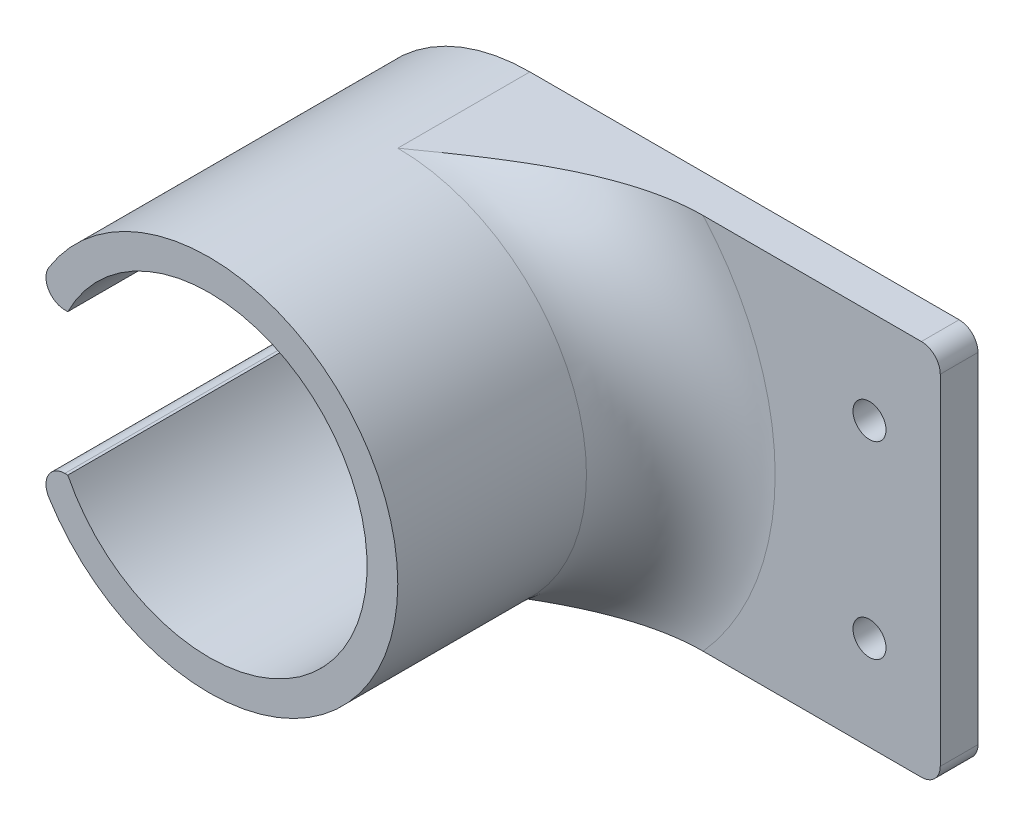
ISO-10303-21;
HEADER;
FILE_DESCRIPTION(('STEP AP214'),'2;1');
FILE_NAME('part.step','',(''),(''),'','','');
FILE_SCHEMA(('AUTOMOTIVE_DESIGN { 1 0 10303 214 1 1 1 1 }'));
ENDSEC;
DATA;
#1=APPLICATION_CONTEXT('core data for automotive mechanical design processes');
#2=APPLICATION_PROTOCOL_DEFINITION('international standard','automotive_design',2000,#1);
#3=PRODUCT_CONTEXT('',#1,'mechanical');
#4=PRODUCT('Part','Part','',(#3));
#5=PRODUCT_RELATED_PRODUCT_CATEGORY('part','',(#4));
#6=PRODUCT_DEFINITION_FORMATION('','',#4);
#7=PRODUCT_DEFINITION_CONTEXT('part definition',#1,'design');
#8=PRODUCT_DEFINITION('design','',#6,#7);
#9=PRODUCT_DEFINITION_SHAPE('','',#8);
#10=(LENGTH_UNIT() NAMED_UNIT(*) SI_UNIT(.MILLI.,.METRE.));
#11=(NAMED_UNIT(*) PLANE_ANGLE_UNIT() SI_UNIT($,.RADIAN.));
#12=(NAMED_UNIT(*) SI_UNIT($,.STERADIAN.) SOLID_ANGLE_UNIT());
#13=UNCERTAINTY_MEASURE_WITH_UNIT(LENGTH_MEASURE(1.E-05),#10,'distance_accuracy_value','');
#14=(GEOMETRIC_REPRESENTATION_CONTEXT(3) GLOBAL_UNCERTAINTY_ASSIGNED_CONTEXT((#13)) GLOBAL_UNIT_ASSIGNED_CONTEXT((#10,
#11,#12)) REPRESENTATION_CONTEXT('',''));
#15=CARTESIAN_POINT('',(0.,0.,0.));
#16=DIRECTION('',(0.,0.,1.));
#17=DIRECTION('',(1.,0.,0.));
#18=AXIS2_PLACEMENT_3D('',#15,#16,#17);
#19=CARTESIAN_POINT('',(0.,0.,4.));
#20=DIRECTION('',(0.,0.,1.));
#21=DIRECTION('',(1.,0.,0.));
#22=AXIS2_PLACEMENT_3D('',#19,#20,#21);
#23=PLANE('',#22);
#24=DIRECTION('',(1.,0.,0.));
#25=VECTOR('',#24,1.);
#26=CARTESIAN_POINT('',(0.,-7.5,4.));
#27=LINE('',#26,#25);
#28=CARTESIAN_POINT('',(-12.7008857958805,-7.5,4.));
#29=VERTEX_POINT('',#28);
#30=CARTESIAN_POINT('',(7.5,-7.5,4.));
#31=VERTEX_POINT('',#30);
#32=EDGE_CURVE('E175',#29,#31,#27,.T.);
#33=ORIENTED_EDGE('',*,*,#32,.F.);
#34=CARTESIAN_POINT('',(0.,0.,4.));
#35=DIRECTION('',(0.,0.,1.));
#36=DIRECTION('',(1.,0.,0.));
#37=AXIS2_PLACEMENT_3D('',#34,#35,#36);
#38=CIRCLE('',#37,14.75);
#39=CARTESIAN_POINT('',(14.5041666666667,-2.6817250615146,4.));
#40=VERTEX_POINT('',#39);
#41=EDGE_CURVE('E204',#29,#40,#38,.T.);
#42=ORIENTED_EDGE('',*,*,#41,.T.);
#43=CARTESIAN_POINT('',(7.5,0.,4.));
#44=DIRECTION('',(0.,0.,1.));
#45=DIRECTION('',(1.,0.,0.));
#46=AXIS2_PLACEMENT_3D('',#43,#44,#45);
#47=CIRCLE('',#46,7.5);
#48=EDGE_CURVE('E196',#31,#40,#47,.T.);
#49=ORIENTED_EDGE('',*,*,#48,.F.);
#50=EDGE_LOOP('',(#33,#42,#49));
#51=FACE_BOUND('',#50,.T.);
#52=ADVANCED_FACE('F47',(#51),#23,.T.);
#53=DIRECTION('',(0.,1.,0.));
#54=VECTOR('',#53,1.);
#55=CARTESIAN_POINT('',(47.5,20.,4.));
#56=LINE('',#55,#54);
#57=CARTESIAN_POINT('',(47.5,-18.,4.));
#58=VERTEX_POINT('',#57);
#59=CARTESIAN_POINT('',(47.5,18.,4.));
#60=VERTEX_POINT('',#59);
#61=EDGE_CURVE('E562',#58,#60,#56,.T.);
#62=ORIENTED_EDGE('',*,*,#61,.T.);
#63=CARTESIAN_POINT('',(45.5,18.,4.));
#64=DIRECTION('',(0.,0.,1.));
#65=DIRECTION('',(1.,0.,0.));
#66=AXIS2_PLACEMENT_3D('',#63,#64,#65);
#67=CIRCLE('',#66,2.);
#68=CARTESIAN_POINT('',(45.5,20.,4.));
#69=VERTEX_POINT('',#68);
#70=EDGE_CURVE('E56',#60,#69,#67,.T.);
#71=ORIENTED_EDGE('',*,*,#70,.T.);
#72=DIRECTION('',(-1.,0.,0.));
#73=VECTOR('',#72,1.);
#74=CARTESIAN_POINT('',(0.,20.,4.));
#75=LINE('',#74,#73);
#76=CARTESIAN_POINT('',(22.3606797749979,20.,4.));
#77=VERTEX_POINT('',#76);
#78=EDGE_CURVE('E566',#69,#77,#75,.T.);
#79=ORIENTED_EDGE('',*,*,#78,.T.);
#80=CARTESIAN_POINT('',(0.,0.,4.));
#81=DIRECTION('',(0.,0.,1.));
#82=DIRECTION('',(1.,0.,0.));
#83=AXIS2_PLACEMENT_3D('',#80,#81,#82);
#84=CIRCLE('',#83,30.);
#85=CARTESIAN_POINT('',(22.3606797749979,-20.,4.));
#86=VERTEX_POINT('',#85);
#87=EDGE_CURVE('E632',#77,#86,#84,.F.);
#88=ORIENTED_EDGE('',*,*,#87,.T.);
#89=DIRECTION('',(1.,0.,0.));
#90=VECTOR('',#89,1.);
#91=CARTESIAN_POINT('',(47.5,-20.,4.));
#92=LINE('',#91,#90);
#93=CARTESIAN_POINT('',(45.5,-20.,4.));
#94=VERTEX_POINT('',#93);
#95=EDGE_CURVE('E559',#86,#94,#92,.T.);
#96=ORIENTED_EDGE('',*,*,#95,.T.);
#97=CARTESIAN_POINT('',(45.5,-18.,4.));
#98=DIRECTION('',(0.,0.,1.));
#99=DIRECTION('',(1.,0.,0.));
#100=AXIS2_PLACEMENT_3D('',#97,#98,#99);
#101=CIRCLE('',#100,2.);
#102=EDGE_CURVE('E620',#94,#58,#101,.T.);
#103=ORIENTED_EDGE('',*,*,#102,.T.);
#104=EDGE_LOOP('',(#62,#71,#79,#88,#96,#103));
#105=FACE_BOUND('',#104,.T.);
#106=CARTESIAN_POINT('',(40.,10.,4.));
#107=DIRECTION('',(0.,0.,1.));
#108=DIRECTION('',(1.,0.,0.));
#109=AXIS2_PLACEMENT_3D('',#106,#107,#108);
#110=CIRCLE('',#109,1.75);
#111=CARTESIAN_POINT('',(41.75,10.,4.));
#112=VERTEX_POINT('',#111);
#113=EDGE_CURVE('E551',#112,#112,#110,.T.);
#114=ORIENTED_EDGE('',*,*,#113,.F.);
#115=EDGE_LOOP('',(#114));
#116=FACE_BOUND('',#115,.T.);
#117=CARTESIAN_POINT('',(40.,-10.,4.));
#118=DIRECTION('',(0.,0.,1.));
#119=DIRECTION('',(1.,0.,0.));
#120=AXIS2_PLACEMENT_3D('',#117,#118,#119);
#121=CIRCLE('',#120,1.75);
#122=CARTESIAN_POINT('',(41.75,-10.,4.));
#123=VERTEX_POINT('',#122);
#124=EDGE_CURVE('E535',#123,#123,#121,.T.);
#125=ORIENTED_EDGE('',*,*,#124,.F.);
#126=EDGE_LOOP('',(#125));
#127=FACE_BOUND('',#126,.T.);
#128=ADVANCED_FACE('F335',(#105,#116,#127),#23,.T.);
#129=CARTESIAN_POINT('',(0.,0.,0.));
#130=DIRECTION('',(0.,0.,1.));
#131=DIRECTION('',(1.,0.,0.));
#132=AXIS2_PLACEMENT_3D('',#129,#130,#131);
#133=PLANE('',#132);
#134=DIRECTION('',(-1.,0.,0.));
#135=VECTOR('',#134,1.);
#136=CARTESIAN_POINT('',(0.,20.,0.));
#137=LINE('',#136,#135);
#138=CARTESIAN_POINT('',(45.5,20.,0.));
#139=VERTEX_POINT('',#138);
#140=CARTESIAN_POINT('',(0.,20.,0.));
#141=VERTEX_POINT('',#140);
#142=EDGE_CURVE('E563',#139,#141,#137,.T.);
#143=ORIENTED_EDGE('',*,*,#142,.F.);
#144=CARTESIAN_POINT('',(45.5,18.,0.));
#145=DIRECTION('',(0.,0.,1.));
#146=DIRECTION('',(1.,0.,0.));
#147=AXIS2_PLACEMENT_3D('',#144,#145,#146);
#148=CIRCLE('',#147,2.);
#149=CARTESIAN_POINT('',(47.5,18.,0.));
#150=VERTEX_POINT('',#149);
#151=EDGE_CURVE('E604',#139,#150,#148,.F.);
#152=ORIENTED_EDGE('',*,*,#151,.T.);
#153=DIRECTION('',(0.,1.,0.));
#154=VECTOR('',#153,1.);
#155=CARTESIAN_POINT('',(47.5,20.,0.));
#156=LINE('',#155,#154);
#157=CARTESIAN_POINT('',(47.5,-18.,0.));
#158=VERTEX_POINT('',#157);
#159=EDGE_CURVE('E577',#158,#150,#156,.T.);
#160=ORIENTED_EDGE('',*,*,#159,.F.);
#161=CARTESIAN_POINT('',(45.5,-18.,0.));
#162=DIRECTION('',(0.,0.,1.));
#163=DIRECTION('',(1.,0.,0.));
#164=AXIS2_PLACEMENT_3D('',#161,#162,#163);
#165=CIRCLE('',#164,2.);
#166=CARTESIAN_POINT('',(45.5,-20.,0.));
#167=VERTEX_POINT('',#166);
#168=EDGE_CURVE('E600',#158,#167,#165,.F.);
#169=ORIENTED_EDGE('',*,*,#168,.T.);
#170=DIRECTION('',(1.,0.,0.));
#171=VECTOR('',#170,1.);
#172=CARTESIAN_POINT('',(47.5,-20.,0.));
#173=LINE('',#172,#171);
#174=CARTESIAN_POINT('',(0.,-20.,0.));
#175=VERTEX_POINT('',#174);
#176=EDGE_CURVE('E574',#175,#167,#173,.T.);
#177=ORIENTED_EDGE('',*,*,#176,.F.);
#178=CARTESIAN_POINT('',(0.,0.,0.));
#179=DIRECTION('',(0.,0.,1.));
#180=DIRECTION('',(1.,0.,0.));
#181=AXIS2_PLACEMENT_3D('',#178,#179,#180);
#182=CIRCLE('',#181,20.);
#183=CARTESIAN_POINT('',(-16.9876498349118,-10.5555555555556,0.));
#184=VERTEX_POINT('',#183);
#185=EDGE_CURVE('E555',#184,#175,#182,.T.);
#186=ORIENTED_EDGE('',*,*,#185,.F.);
#187=CARTESIAN_POINT('',(-15.2888848514207,-9.5,0.));
#188=DIRECTION('',(0.,0.,1.));
#189=DIRECTION('',(1.,0.,0.));
#190=AXIS2_PLACEMENT_3D('',#187,#188,#189);
#191=CIRCLE('',#190,2.);
#192=CARTESIAN_POINT('',(-15.2888848514207,-7.5,0.));
#193=VERTEX_POINT('',#192);
#194=EDGE_CURVE('E683',#184,#193,#191,.F.);
#195=ORIENTED_EDGE('',*,*,#194,.T.);
#196=DIRECTION('',(1.,0.,0.));
#197=VECTOR('',#196,1.);
#198=CARTESIAN_POINT('',(0.,-7.5,0.));
#199=LINE('',#198,#197);
#200=CARTESIAN_POINT('',(7.5,-7.5,0.));
#201=VERTEX_POINT('',#200);
#202=EDGE_CURVE('E652',#193,#201,#199,.T.);
#203=ORIENTED_EDGE('',*,*,#202,.T.);
#204=CARTESIAN_POINT('',(7.5,0.,0.));
#205=DIRECTION('',(0.,0.,-1.));
#206=DIRECTION('',(-1.,0.,0.));
#207=AXIS2_PLACEMENT_3D('',#204,#205,#206);
#208=CIRCLE('',#207,7.5);
#209=CARTESIAN_POINT('',(7.5,7.5,0.));
#210=VERTEX_POINT('',#209);
#211=EDGE_CURVE('E199',#210,#201,#208,.T.);
#212=ORIENTED_EDGE('',*,*,#211,.F.);
#213=DIRECTION('',(-1.,0.,0.));
#214=VECTOR('',#213,1.);
#215=CARTESIAN_POINT('',(0.,7.5,0.));
#216=LINE('',#215,#214);
#217=CARTESIAN_POINT('',(-15.2888848514207,7.5,0.));
#218=VERTEX_POINT('',#217);
#219=EDGE_CURVE('E225',#210,#218,#216,.T.);
#220=ORIENTED_EDGE('',*,*,#219,.T.);
#221=CARTESIAN_POINT('',(-15.2888848514207,9.5,0.));
#222=DIRECTION('',(0.,0.,1.));
#223=DIRECTION('',(1.,0.,0.));
#224=AXIS2_PLACEMENT_3D('',#221,#222,#223);
#225=CIRCLE('',#224,2.);
#226=CARTESIAN_POINT('',(-16.9876498349118,10.5555555555556,0.));
#227=VERTEX_POINT('',#226);
#228=EDGE_CURVE('E681',#218,#227,#225,.F.);
#229=ORIENTED_EDGE('',*,*,#228,.T.);
#230=EDGE_CURVE('E570',#141,#227,#182,.T.);
#231=ORIENTED_EDGE('',*,*,#230,.F.);
#232=EDGE_LOOP('',(#143,#152,#160,#169,#177,#186,#195,#203,#212,#220,#229,#231));
#233=FACE_BOUND('',#232,.T.);
#234=CARTESIAN_POINT('',(40.,10.,0.));
#235=DIRECTION('',(0.,0.,1.));
#236=DIRECTION('',(1.,0.,0.));
#237=AXIS2_PLACEMENT_3D('',#234,#235,#236);
#238=CIRCLE('',#237,1.75);
#239=CARTESIAN_POINT('',(41.75,10.,0.));
#240=VERTEX_POINT('',#239);
#241=EDGE_CURVE('E545',#240,#240,#238,.T.);
#242=ORIENTED_EDGE('',*,*,#241,.T.);
#243=EDGE_LOOP('',(#242));
#244=FACE_BOUND('',#243,.T.);
#245=CARTESIAN_POINT('',(40.,-10.,0.));
#246=DIRECTION('',(0.,0.,1.));
#247=DIRECTION('',(1.,0.,0.));
#248=AXIS2_PLACEMENT_3D('',#245,#246,#247);
#249=CIRCLE('',#248,1.75);
#250=CARTESIAN_POINT('',(41.75,-10.,0.));
#251=VERTEX_POINT('',#250);
#252=EDGE_CURVE('E538',#251,#251,#249,.T.);
#253=ORIENTED_EDGE('',*,*,#252,.T.);
#254=EDGE_LOOP('',(#253));
#255=FACE_BOUND('',#254,.T.);
#256=ADVANCED_FACE('F339',(#233,#244,#255),#133,.F.);
#257=CARTESIAN_POINT('',(0.,0.,4.));
#258=DIRECTION('',(0.,0.,-1.));
#259=DIRECTION('',(-1.,0.,0.));
#260=AXIS2_PLACEMENT_3D('',#257,#258,#259);
#261=CYLINDRICAL_SURFACE('',#260,20.);
#262=CARTESIAN_POINT('',(0.,0.,34.));
#263=DIRECTION('',(0.,0.,1.));
#264=DIRECTION('',(1.,0.,0.));
#265=AXIS2_PLACEMENT_3D('',#262,#263,#264);
#266=CIRCLE('',#265,20.);
#267=CARTESIAN_POINT('',(-16.9876498349118,-10.5555555555556,34.));
#268=VERTEX_POINT('',#267);
#269=CARTESIAN_POINT('',(-16.9876498349118,10.5555555555556,34.));
#270=VERTEX_POINT('',#269);
#271=EDGE_CURVE('E541',#268,#270,#266,.T.);
#272=ORIENTED_EDGE('',*,*,#271,.F.);
#273=DIRECTION('',(0.,0.,-1.));
#274=VECTOR('',#273,1.);
#275=CARTESIAN_POINT('',(-16.9876498349118,-10.5555555555556,4.));
#276=LINE('',#275,#274);
#277=EDGE_CURVE('E595',#268,#184,#276,.T.);
#278=ORIENTED_EDGE('',*,*,#277,.T.);
#279=ORIENTED_EDGE('',*,*,#185,.T.);
#280=DIRECTION('',(0.,0.,-1.));
#281=VECTOR('',#280,1.);
#282=CARTESIAN_POINT('',(0.,-20.,4.));
#283=LINE('',#282,#281);
#284=CARTESIAN_POINT('',(0.,-20.,14.));
#285=VERTEX_POINT('',#284);
#286=EDGE_CURVE('E189',#285,#175,#283,.T.);
#287=ORIENTED_EDGE('',*,*,#286,.F.);
#288=CARTESIAN_POINT('',(0.,0.,14.));
#289=DIRECTION('',(0.,0.,1.));
#290=DIRECTION('',(1.,0.,0.));
#291=AXIS2_PLACEMENT_3D('',#288,#289,#290);
#292=CIRCLE('',#291,20.);
#293=CARTESIAN_POINT('',(0.,20.,14.));
#294=VERTEX_POINT('',#293);
#295=EDGE_CURVE('E212',#285,#294,#292,.T.);
#296=ORIENTED_EDGE('',*,*,#295,.T.);
#297=DIRECTION('',(0.,0.,-1.));
#298=VECTOR('',#297,1.);
#299=CARTESIAN_POINT('',(0.,20.,4.));
#300=LINE('',#299,#298);
#301=EDGE_CURVE('E569',#294,#141,#300,.T.);
#302=ORIENTED_EDGE('',*,*,#301,.T.);
#303=ORIENTED_EDGE('',*,*,#230,.T.);
#304=DIRECTION('',(0.,0.,-1.));
#305=VECTOR('',#304,1.);
#306=CARTESIAN_POINT('',(-16.9876498349118,10.5555555555556,4.));
#307=LINE('',#306,#305);
#308=EDGE_CURVE('E301',#227,#270,#307,.F.);
#309=ORIENTED_EDGE('',*,*,#308,.T.);
#310=EDGE_LOOP('',(#272,#278,#279,#287,#296,#302,#303,#309));
#311=FACE_BOUND('',#310,.T.);
#312=ADVANCED_FACE('F374',(#311),#261,.T.);
#313=CARTESIAN_POINT('',(47.5,-20.,4.));
#314=DIRECTION('',(0.,1.,0.));
#315=DIRECTION('',(-1.,0.,0.));
#316=AXIS2_PLACEMENT_3D('',#313,#314,#315);
#317=PLANE('',#316);
#318=ORIENTED_EDGE('',*,*,#176,.T.);
#319=DIRECTION('',(0.,0.,-1.));
#320=VECTOR('',#319,1.);
#321=CARTESIAN_POINT('',(45.5,-20.,4.));
#322=LINE('',#321,#320);
#323=EDGE_CURVE('E11',#167,#94,#322,.F.);
#324=ORIENTED_EDGE('',*,*,#323,.T.);
#325=ORIENTED_EDGE('',*,*,#95,.F.);
#326=CARTESIAN_POINT('',(22.3606797749979,-20.,4.));
#327=CARTESIAN_POINT('',(21.7668018034509,-20.,4.00003263304139));
#328=CARTESIAN_POINT('',(21.1735054519941,-20.,4.02937199032722));
#329=CARTESIAN_POINT('',(19.9929463902144,-20.,4.14044320763126));
#330=CARTESIAN_POINT('',(19.4056740045382,-20.,4.22207043394376));
#331=CARTESIAN_POINT('',(18.2492269467343,-20.,4.4298222050329));
#332=CARTESIAN_POINT('',(17.6799134884316,-20.,4.55519253264605));
#333=CARTESIAN_POINT('',(16.5512195723283,-20.,4.84528301300506));
#334=CARTESIAN_POINT('',(15.9918448606384,-20.,5.01002518123025));
#335=CARTESIAN_POINT('',(14.2261122860694,-20.,5.58998860297849));
#336=CARTESIAN_POINT('',(13.040827012144,-20.,6.07022599754348));
#337=CARTESIAN_POINT('',(11.3048964890977,-20.,6.87830371516584));
#338=CARTESIAN_POINT('',(10.7327633759368,-20.,7.16257464351929));
#339=CARTESIAN_POINT('',(9.60126056211567,-20.,7.75554576306232));
#340=CARTESIAN_POINT('',(9.04188966050424,-20.,8.0642436433063));
#341=CARTESIAN_POINT('',(7.37111678417109,-20.,9.02560610499008));
#342=CARTESIAN_POINT('',(6.27728151271615,-20.,9.70859299261349));
#343=CARTESIAN_POINT('',(4.12150483975176,-20.,11.1209344512402));
#344=CARTESIAN_POINT('',(3.05954929259503,-20.,11.8502679958212));
#345=CARTESIAN_POINT('',(1.34193969195753,-20.,13.051169366932));
#346=CARTESIAN_POINT('',(0.682503584222825,-20.,13.5173978259668));
#347=CARTESIAN_POINT('',(0.0153960074116556,-20.,13.9891133783914));
#348=CARTESIAN_POINT('',(0.00769800382480433,-20.,13.9945566889278));
#349=CARTESIAN_POINT('',(0.,-20.,14.));
#350=B_SPLINE_CURVE_WITH_KNOTS('',3,(#326,#327,#328,#329,#330,#331,#332,#333,#334,#335,#336,
#337,#338,#339,#340,#341,#342,#343,#344,#345,#346,#347,#348,#349),.UNSPECIFIED.,.F.,.F.,(4,2,2,
2,2,2,2,2,2,2,2,4),(0.,1.78007201554742,3.55659299450599,5.30388464058657,7.05215561193781,
10.8779322078743,12.7942256891128,14.7103380930116,18.5765462026268,22.4410126539085,
24.8638369819083,24.8921212531558),.UNSPECIFIED.);
#351=EDGE_CURVE('E235',#86,#285,#350,.T.);
#352=ORIENTED_EDGE('',*,*,#351,.T.);
#353=ORIENTED_EDGE('',*,*,#286,.T.);
#354=EDGE_LOOP('',(#318,#324,#325,#352,#353));
#355=FACE_BOUND('',#354,.T.);
#356=ADVANCED_FACE('F378',(#355),#317,.F.);
#357=CARTESIAN_POINT('',(47.5,20.,4.));
#358=DIRECTION('',(-1.,0.,0.));
#359=DIRECTION('',(0.,0.,1.));
#360=AXIS2_PLACEMENT_3D('',#357,#358,#359);
#361=PLANE('',#360);
#362=ORIENTED_EDGE('',*,*,#159,.T.);
#363=DIRECTION('',(0.,0.,-1.));
#364=VECTOR('',#363,1.);
#365=CARTESIAN_POINT('',(47.5,18.,4.));
#366=LINE('',#365,#364);
#367=EDGE_CURVE('E69',#150,#60,#366,.F.);
#368=ORIENTED_EDGE('',*,*,#367,.T.);
#369=ORIENTED_EDGE('',*,*,#61,.F.);
#370=DIRECTION('',(0.,0.,-1.));
#371=VECTOR('',#370,1.);
#372=CARTESIAN_POINT('',(47.5,-18.,4.));
#373=LINE('',#372,#371);
#374=EDGE_CURVE('E609',#58,#158,#373,.T.);
#375=ORIENTED_EDGE('',*,*,#374,.T.);
#376=EDGE_LOOP('',(#362,#368,#369,#375));
#377=FACE_BOUND('',#376,.T.);
#378=ADVANCED_FACE('F466',(#377),#361,.F.);
#379=CARTESIAN_POINT('',(0.,20.,4.));
#380=DIRECTION('',(0.,-1.,0.));
#381=DIRECTION('',(1.,0.,0.));
#382=AXIS2_PLACEMENT_3D('',#379,#380,#381);
#383=PLANE('',#382);
#384=ORIENTED_EDGE('',*,*,#78,.F.);
#385=DIRECTION('',(0.,0.,-1.));
#386=VECTOR('',#385,1.);
#387=CARTESIAN_POINT('',(45.5,20.,4.));
#388=LINE('',#387,#386);
#389=EDGE_CURVE('E605',#69,#139,#388,.T.);
#390=ORIENTED_EDGE('',*,*,#389,.T.);
#391=ORIENTED_EDGE('',*,*,#142,.T.);
#392=ORIENTED_EDGE('',*,*,#301,.F.);
#393=CARTESIAN_POINT('',(22.3606797749979,20.,4.));
#394=CARTESIAN_POINT('',(21.7668018034508,20.,4.00003263304139));
#395=CARTESIAN_POINT('',(21.1735054519941,20.,4.02937199032722));
#396=CARTESIAN_POINT('',(19.9929463902143,20.,4.14044320763127));
#397=CARTESIAN_POINT('',(19.405674004538,20.,4.22207043394378));
#398=CARTESIAN_POINT('',(18.2492269467342,20.,4.42982220503293));
#399=CARTESIAN_POINT('',(17.6799134884315,20.,4.55519253264607));
#400=CARTESIAN_POINT('',(16.5512195723283,20.,4.84528301300507));
#401=CARTESIAN_POINT('',(15.9918448606384,20.,5.01002518123025));
#402=CARTESIAN_POINT('',(14.2261122860694,20.,5.58998860297849));
#403=CARTESIAN_POINT('',(13.040827012144,20.,6.07022599754347));
#404=CARTESIAN_POINT('',(11.3048964890978,20.,6.87830371516582));
#405=CARTESIAN_POINT('',(10.7327633759368,20.,7.16257464351927));
#406=CARTESIAN_POINT('',(9.60126056211573,20.,7.75554576306229));
#407=CARTESIAN_POINT('',(9.0418896605043,20.,8.06424364330627));
#408=CARTESIAN_POINT('',(7.37111678417113,20.,9.02560610499003));
#409=CARTESIAN_POINT('',(6.27728151271612,20.,9.70859299261338));
#410=CARTESIAN_POINT('',(4.12150483975182,20.,11.1209344512403));
#411=CARTESIAN_POINT('',(3.05954929259524,20.,11.8502679958216));
#412=CARTESIAN_POINT('',(1.34193969195732,20.,13.0511693669318));
#413=CARTESIAN_POINT('',(0.682503584222314,20.,13.5173978259661));
#414=CARTESIAN_POINT('',(0.0153960074116444,20.,13.9891133783914));
#415=CARTESIAN_POINT('',(0.00769800382479868,20.,13.9945566889278));
#416=CARTESIAN_POINT('',(0.,20.,14.));
#417=B_SPLINE_CURVE_WITH_KNOTS('',3,(#393,#394,#395,#396,#397,#398,#399,#400,#401,#402,#403,
#404,#405,#406,#407,#408,#409,#410,#411,#412,#413,#414,#415,#416),.UNSPECIFIED.,.F.,.F.,(4,2,2,
2,2,2,2,2,2,2,2,4),(0.,1.78007201554749,3.55659299450612,5.30388464058663,7.05215561193781,
10.8779322078743,12.7942256891127,14.7103380930115,18.5765462026267,22.4410126539085,
24.8638369819083,24.8921212531558),.UNSPECIFIED.);
#418=EDGE_CURVE('E242',#294,#77,#417,.F.);
#419=ORIENTED_EDGE('',*,*,#418,.T.);
#420=EDGE_LOOP('',(#384,#390,#391,#392,#419));
#421=FACE_BOUND('',#420,.T.);
#422=ADVANCED_FACE('F461',(#421),#383,.F.);
#423=CARTESIAN_POINT('',(40.,10.,4.));
#424=DIRECTION('',(0.,0.,-1.));
#425=DIRECTION('',(-1.,0.,0.));
#426=AXIS2_PLACEMENT_3D('',#423,#424,#425);
#427=CYLINDRICAL_SURFACE('',#426,1.75);
#428=ORIENTED_EDGE('',*,*,#113,.T.);
#429=EDGE_LOOP('',(#428));
#430=FACE_BOUND('',#429,.T.);
#431=ORIENTED_EDGE('',*,*,#241,.F.);
#432=EDGE_LOOP('',(#431));
#433=FACE_BOUND('',#432,.T.);
#434=ADVANCED_FACE('F465',(#430,#433),#427,.F.);
#435=CARTESIAN_POINT('',(40.,-10.,4.));
#436=DIRECTION('',(0.,0.,-1.));
#437=DIRECTION('',(-1.,0.,0.));
#438=AXIS2_PLACEMENT_3D('',#435,#436,#437);
#439=CYLINDRICAL_SURFACE('',#438,1.75);
#440=ORIENTED_EDGE('',*,*,#124,.T.);
#441=EDGE_LOOP('',(#440));
#442=FACE_BOUND('',#441,.T.);
#443=ORIENTED_EDGE('',*,*,#252,.F.);
#444=EDGE_LOOP('',(#443));
#445=FACE_BOUND('',#444,.T.);
#446=ADVANCED_FACE('F387',(#442,#445),#439,.F.);
#447=CARTESIAN_POINT('',(0.,0.,34.));
#448=DIRECTION('',(0.,0.,1.));
#449=DIRECTION('',(1.,0.,0.));
#450=AXIS2_PLACEMENT_3D('',#447,#448,#449);
#451=PLANE('',#450);
#452=DIRECTION('',(-1.,0.,0.));
#453=VECTOR('',#452,1.);
#454=CARTESIAN_POINT('',(7.5,-7.5,34.));
#455=LINE('',#454,#453);
#456=CARTESIAN_POINT('',(-14.9770658007502,-7.5,34.));
#457=VERTEX_POINT('',#456);
#458=CARTESIAN_POINT('',(-15.2888848514207,-7.5,34.));
#459=VERTEX_POINT('',#458);
#460=EDGE_CURVE('E667',#457,#459,#455,.T.);
#461=ORIENTED_EDGE('',*,*,#460,.T.);
#462=CARTESIAN_POINT('',(-15.2888848514207,-9.5,34.));
#463=DIRECTION('',(0.,0.,1.));
#464=DIRECTION('',(1.,0.,0.));
#465=AXIS2_PLACEMENT_3D('',#462,#463,#464);
#466=CIRCLE('',#465,2.);
#467=EDGE_CURVE('E691',#459,#268,#466,.T.);
#468=ORIENTED_EDGE('',*,*,#467,.T.);
#469=ORIENTED_EDGE('',*,*,#271,.T.);
#470=CARTESIAN_POINT('',(-15.2888848514207,9.5,34.));
#471=DIRECTION('',(0.,0.,1.));
#472=DIRECTION('',(1.,0.,0.));
#473=AXIS2_PLACEMENT_3D('',#470,#471,#472);
#474=CIRCLE('',#473,2.);
#475=CARTESIAN_POINT('',(-15.2888848514207,7.5,34.));
#476=VERTEX_POINT('',#475);
#477=EDGE_CURVE('E669',#270,#476,#474,.T.);
#478=ORIENTED_EDGE('',*,*,#477,.T.);
#479=DIRECTION('',(1.,0.,0.));
#480=VECTOR('',#479,1.);
#481=CARTESIAN_POINT('',(7.5,7.5,34.));
#482=LINE('',#481,#480);
#483=CARTESIAN_POINT('',(-14.9770658007502,7.5,34.));
#484=VERTEX_POINT('',#483);
#485=EDGE_CURVE('E202',#476,#484,#482,.T.);
#486=ORIENTED_EDGE('',*,*,#485,.T.);
#487=CARTESIAN_POINT('',(0.,0.,34.));
#488=DIRECTION('',(0.,0.,1.));
#489=DIRECTION('',(1.,0.,0.));
#490=AXIS2_PLACEMENT_3D('',#487,#488,#489);
#491=CIRCLE('',#490,16.75);
#492=EDGE_CURVE('E548',#457,#484,#491,.T.);
#493=ORIENTED_EDGE('',*,*,#492,.F.);
#494=EDGE_LOOP('',(#461,#468,#469,#478,#486,#493));
#495=FACE_BOUND('',#494,.T.);
#496=ADVANCED_FACE('F273',(#495),#451,.T.);
#497=CARTESIAN_POINT('',(0.,0.,34.));
#498=DIRECTION('',(0.,0.,-1.));
#499=DIRECTION('',(-1.,0.,0.));
#500=AXIS2_PLACEMENT_3D('',#497,#498,#499);
#501=CYLINDRICAL_SURFACE('',#500,16.75);
#502=DIRECTION('',(0.,0.,-1.));
#503=VECTOR('',#502,1.);
#504=CARTESIAN_POINT('',(-14.9770658007502,7.5,34.));
#505=LINE('',#504,#503);
#506=CARTESIAN_POINT('',(-14.9770658007502,7.5,6.));
#507=VERTEX_POINT('',#506);
#508=EDGE_CURVE('E651',#507,#484,#505,.F.);
#509=ORIENTED_EDGE('',*,*,#508,.F.);
#510=CARTESIAN_POINT('',(0.,0.,6.));
#511=DIRECTION('',(0.,0.,1.));
#512=DIRECTION('',(1.,0.,0.));
#513=AXIS2_PLACEMENT_3D('',#510,#511,#512);
#514=CIRCLE('',#513,16.75);
#515=CARTESIAN_POINT('',(16.4708333333333,3.04534879866912,6.));
#516=VERTEX_POINT('',#515);
#517=EDGE_CURVE('E263',#507,#516,#514,.F.);
#518=ORIENTED_EDGE('',*,*,#517,.T.);
#519=CARTESIAN_POINT('',(15.9505788675956,5.11287920731671,5.94987984284756));
#520=CARTESIAN_POINT('',(16.0003082966242,4.95773899226411,3.47216732107097));
#521=CARTESIAN_POINT('',(13.6794377144012,4.25024111478821,4.));
#522=CARTESIAN_POINT('',(16.0177412429025,4.90337723381543,5.96258487059454));
#523=CARTESIAN_POINT('',(16.0550593484335,4.78036957865644,3.549592780556));
#524=CARTESIAN_POINT('',(13.7786800156369,4.10601124006457,4.));
#525=CARTESIAN_POINT('',(16.0808189659863,4.69237216558887,5.97219791683703));
#526=CARTESIAN_POINT('',(16.1096418073176,4.59289475632053,3.61953659787191));
#527=CARTESIAN_POINT('',(13.8744627693304,3.95587628529017,4.));
#528=CARTESIAN_POINT('',(16.1986403299141,4.26790169232043,5.98666058186651));
#529=CARTESIAN_POINT('',(16.2141358501095,4.20784053352845,3.74376135927388));
#530=CARTESIAN_POINT('',(14.0574050856073,3.64457066622454,4.));
#531=CARTESIAN_POINT('',(16.2533864810883,4.05443704929218,5.99151163786742));
#532=CARTESIAN_POINT('',(16.2643790657867,4.00978007042261,3.79871079688693));
#533=CARTESIAN_POINT('',(14.1445672428225,3.4834033473244,4.));
#534=CARTESIAN_POINT('',(16.3543941661064,3.62557865723691,5.99787514250514));
#535=CARTESIAN_POINT('',(16.3584938306032,3.60620219064712,3.89560477724452));
#536=CARTESIAN_POINT('',(14.3085832069233,3.15080670052285,4.));
#537=CARTESIAN_POINT('',(16.4006601335294,3.41018597835622,5.99938934029702));
#538=CARTESIAN_POINT('',(16.4026843133134,3.40010633589762,3.93802391905863));
#539=CARTESIAN_POINT('',(14.3854423946908,2.97938279747367,4.));
#540=CARTESIAN_POINT('',(16.4846649242135,2.97772415298687,6.00030396486693));
#541=CARTESIAN_POINT('',(16.4837168537462,2.98227010587435,4.01207449676235));
#542=CARTESIAN_POINT('',(14.5273344056079,2.6272776794202,4.));
#543=CARTESIAN_POINT('',(16.5224030901489,2.76065487859846,5.99970422876137));
#544=CARTESIAN_POINT('',(16.5208374812251,2.76987278614159,4.04403341359768));
#545=CARTESIAN_POINT('',(14.5923663170321,2.44659575212046,4.));
#546=CARTESIAN_POINT('',(16.5884673989609,2.3305418811657,5.9974918046817));
#547=CARTESIAN_POINT('',(16.5862041707078,2.34621457179201,4.09817993781891));
#548=CARTESIAN_POINT('',(14.7077278902359,2.08190601148726,4.));
#549=CARTESIAN_POINT('',(16.6170015047774,2.11752984604955,5.99590429687421));
#550=CARTESIAN_POINT('',(16.6148522828687,2.13445863937957,4.12079118264495));
#551=CARTESIAN_POINT('',(14.75837875326,1.89808817004059,4.));
#552=CARTESIAN_POINT('',(16.665852885763,1.69056726643116,5.99256355342676));
#553=CARTESIAN_POINT('',(16.6640277639659,1.70835542036285,4.15854851010028));
#554=CARTESIAN_POINT('',(14.8459162179312,1.52456699728881,4.));
#555=CARTESIAN_POINT('',(16.6861701658906,1.47661672249533,5.99081031788682));
#556=CARTESIAN_POINT('',(16.6847207899741,1.49331310088098,4.17383426763433));
#557=CARTESIAN_POINT('',(14.8828028278841,1.33486366953536,4.));
#558=CARTESIAN_POINT('',(16.7185588015947,1.04807783505523,5.98776262916382));
#559=CARTESIAN_POINT('',(16.7177079660575,1.06179938186949,4.19779603273431));
#560=CARTESIAN_POINT('',(14.9419407595896,0.951394750980597,4.));
#561=CARTESIAN_POINT('',(16.7306297805152,0.833489462867216,5.98646819693827));
#562=CARTESIAN_POINT('',(16.730113774429,0.844606107776836,4.20655652599181));
#563=CARTESIAN_POINT('',(14.9641914128316,0.757628975040401,4.));
#564=CARTESIAN_POINT('',(16.7465059997805,0.403999909880524,5.98472561664843));
#565=CARTESIAN_POINT('',(16.7463920975981,0.409914535904877,4.21798948870537));
#566=CARTESIAN_POINT('',(14.9935096442861,0.368061517903531,4.));
#567=CARTESIAN_POINT('',(16.7503111286321,0.189098724901622,5.98427747999933));
#568=CARTESIAN_POINT('',(16.7503200615372,0.191678190519051,4.22070121077539));
#569=CARTESIAN_POINT('',(15.0005770177001,0.172259809281135,4.));
#570=CARTESIAN_POINT('',(16.7496344711393,-0.250216965987576,5.98435574303145));
#571=CARTESIAN_POINT('',(16.749623978128,-0.25366619540928,4.22021847829123));
#572=CARTESIAN_POINT('',(14.9993221432655,-0.227936004380487,4.));
#573=CARTESIAN_POINT('',(16.7447779317102,-0.474630976943812,5.98492621474205));
#574=CARTESIAN_POINT('',(16.7446102349874,-0.481565968092966,4.21675489089321));
#575=CARTESIAN_POINT('',(14.9903039401537,-0.432326315718984,4.));
#576=CARTESIAN_POINT('',(16.7260513826182,-0.923076077876473,5.98695548528712));
#577=CARTESIAN_POINT('',(16.7254209470668,-0.935242619875944,4.2032369173152));
#578=CARTESIAN_POINT('',(14.9557568430206,-0.838605258227304,4.));
#579=CARTESIAN_POINT('',(16.7121813777492,-1.1471071680565,5.9884142836491));
#580=CARTESIAN_POINT('',(16.7111739767377,-1.16185856831514,4.19313168402316));
#581=CARTESIAN_POINT('',(14.9302279577809,-1.04049389072766,4.));
#582=CARTESIAN_POINT('',(16.6754511893566,-1.59442371157164,5.99173633904748));
#583=CARTESIAN_POINT('',(16.6738248906512,-1.61172769787834,4.16578730891991));
#584=CARTESIAN_POINT('',(14.8633406291882,-1.43949168635427,4.));
#585=CARTESIAN_POINT('',(16.6525911393738,-1.81770917593282,5.99359959007584));
#586=CARTESIAN_POINT('',(16.6505846780741,-1.83579877648645,4.14844206126797));
#587=CARTESIAN_POINT('',(14.8219824209689,-1.63660092042897,4.));
#588=CARTESIAN_POINT('',(16.5979172286893,-2.26318450871097,5.99697214197623));
#589=CARTESIAN_POINT('',(16.5957238176095,-2.27929470705689,4.10570405225925));
#590=CARTESIAN_POINT('',(14.7244935407452,-2.02400518993949,4.));
#591=CARTESIAN_POINT('',(16.5661033724565,-2.48537437767467,5.99848144302493));
#592=CARTESIAN_POINT('',(16.563901968926,-2.49950340002681,4.08013686976804));
#593=CARTESIAN_POINT('',(14.6683628761134,-2.21430022877614,4.));
#594=CARTESIAN_POINT('',(16.4926148313627,-2.93414455774959,6.00018115895081));
#595=CARTESIAN_POINT('',(16.4915894936959,-2.93969100012798,4.01885950795048));
#596=CARTESIAN_POINT('',(14.5410258042401,-2.59124866750303,4.));
#597=CARTESIAN_POINT('',(16.4507023446588,-3.16068623362954,6.00033576331048));
#598=CARTESIAN_POINT('',(16.450631424421,-3.16020560550079,3.98263131832396));
#599=CARTESIAN_POINT('',(14.4694610379634,-2.77767388704803,4.));
#600=CARTESIAN_POINT('',(16.3575782009438,-3.61181165416336,5.997952655197));
#601=CARTESIAN_POINT('',(16.3616243251202,-3.5930520689834,3.89855340165868));
#602=CARTESIAN_POINT('',(14.3138998158591,-3.14000839323689,4.));
#603=CARTESIAN_POINT('',(16.3063675099321,-3.83639559966994,5.99541522226964));
#604=CARTESIAN_POINT('',(16.3132428787226,-3.80611381088718,3.85028735415795));
#605=CARTESIAN_POINT('',(14.2299046516047,-3.31591876975663,4.));
#606=CARTESIAN_POINT('',(16.1947108672487,-4.28332756664957,5.98619788882577));
#607=CARTESIAN_POINT('',(16.210731534284,-4.22203362427389,3.73976680201736));
#608=CARTESIAN_POINT('',(14.0512569721356,-3.65622192748987,4.));
#609=CARTESIAN_POINT('',(16.1342586719271,-4.50567396735298,5.97951517831591));
#610=CARTESIAN_POINT('',(16.1562264560576,-4.42551588089562,3.67689912160083));
#611=CARTESIAN_POINT('',(13.9565972633099,-3.82060681162013,4.));
#612=CARTESIAN_POINT('',(16.0043175960467,-4.94746919000512,5.96030018100414));
#613=CARTESIAN_POINT('',(16.0437312928018,-4.81911654772961,3.53437924286462));
#614=CARTESIAN_POINT('',(13.7585627177171,-4.13707543761705,4.));
#615=CARTESIAN_POINT('',(15.9348250417858,-5.16691679382608,5.94776551076981));
#616=CARTESIAN_POINT('',(15.9853650544416,-5.00972208293817,3.45384928701389));
#617=CARTESIAN_POINT('',(13.6551843440131,-4.28915413768417,4.));
#618=CARTESIAN_POINT('',(15.8609236674532,-5.38457058782053,5.93145423665738));
#619=CARTESIAN_POINT('',(15.9276038249014,-5.1881558746749,3.36456602850587));
#620=CARTESIAN_POINT('',(13.5484344163724,-4.43468613442284,4.));
#621=(BOUNDED_SURFACE() B_SPLINE_SURFACE(3,2,((#519,#520,#521),(#522,#523,#524),(#525,#526,
#527),(#528,#529,#530),(#531,#532,#533),(#534,#535,#536),(#537,#538,#539),(#540,#541,#542),
(#543,#544,#545),(#546,#547,#548),(#549,#550,#551),(#552,#553,#554),(#555,#556,#557),(#558,#559,
#560),(#561,#562,#563),(#564,#565,#566),(#567,#568,#569),(#570,#571,#572),(#573,#574,#575),
(#576,#577,#578),(#579,#580,#581),(#582,#583,#584),(#585,#586,#587),(#588,#589,#590),(#591,#592,
#593),(#594,#595,#596),(#597,#598,#599),(#600,#601,#602),(#603,#604,#605),(#606,#607,#608),
(#609,#610,#611),(#612,#613,#614),(#615,#616,#617),(#618,#619,#620)),.UNSPECIFIED.,.F.,.F.,
.F.) B_SPLINE_SURFACE_WITH_KNOTS((4,2,2,2,2,2,2,2,2,2,2,2,2,2,2,2,4),(3,3),(0.,
0.582334230747748,1.16449265340189,1.74634584048554,2.32824386170538,2.89588378798621,
3.46352337172653,4.03118888111169,4.59886204735992,5.19169466814504,5.78452697361607,
6.37735047331321,6.97017367714029,7.57862197987051,8.18700710646338,8.79580509545206,
9.40485125710614),(0.,1.),
.UNSPECIFIED.) GEOMETRIC_REPRESENTATION_ITEM() RATIONAL_B_SPLINE_SURFACE(((1.,0.627282929687742,
1.),(1.,0.637668694249663,1.),(1.,0.647376844444689,1.),(1.,0.6654626068952,1.),(1.,
0.673840619958414,1.),(1.,0.68929298465484,1.),(1.,0.696368017516746,1.),(1.,0.709222667611663,
1.),(1.,0.715002184985665,1.),(1.,0.725132002740249,1.),(1.,0.729513852919987,1.),(1.,
0.737024573791736,1.),(1.,0.740153445239853,1.),(1.,0.745145561031359,1.),(1.,0.747008747563587,
1.),(1.,0.749460011188115,1.),(1.,0.750048071080973,1.),(1.,0.749943524456392,1.),(1.,
0.749193003277553,1.),(1.,0.746302118334183,1.),(1.,0.744161755308877,1.),(1.,0.73850263681941,
1.),(1.,0.734983901829998,1.),(1.,0.726582884597121,1.),(1.,0.721700603034185,1.),(1.,
0.710439451192184,1.),(1.,0.704024526882924,1.),(1.,0.689778756343151,1.),(1.,0.68194805719918,
1.),(1.,0.66485635833867,1.),(1.,0.655594391597601,1.),(1.,0.635597884619697,1.),(1.,
0.624862745636645,1.),(1.,0.613371702178168,1.))) REPRESENTATION_ITEM('') SURFACE());
#622=CARTESIAN_POINT('',(15.9505788675956,5.11287920731671,5.94987984284756));
#623=CARTESIAN_POINT('',(16.0177412429025,4.90337723381543,5.96258487059454));
#624=CARTESIAN_POINT('',(16.0808189659863,4.69237216558887,5.97219791683703));
#625=CARTESIAN_POINT('',(16.1986403299141,4.26790169232044,5.98666058186651));
#626=CARTESIAN_POINT('',(16.2533864810883,4.05443704929218,5.99151163786742));
#627=CARTESIAN_POINT('',(16.3543941661064,3.62557865723691,5.99787514250514));
#628=CARTESIAN_POINT('',(16.4006601335294,3.41018597835622,5.99938934029702));
#629=CARTESIAN_POINT('',(16.4846649242135,2.97772415298687,6.00030396486693));
#630=CARTESIAN_POINT('',(16.5224030901489,2.76065487859846,5.99970422876137));
#631=CARTESIAN_POINT('',(16.5884673989609,2.3305418811657,5.9974918046817));
#632=CARTESIAN_POINT('',(16.6170015047774,2.11752984604955,5.99590429687421));
#633=CARTESIAN_POINT('',(16.665852885763,1.69056726643116,5.99256355342676));
#634=CARTESIAN_POINT('',(16.6861701658906,1.47661672249533,5.99081031788682));
#635=CARTESIAN_POINT('',(16.7185588015947,1.04807783505523,5.98776262916382));
#636=CARTESIAN_POINT('',(16.7306297805152,0.833489462867216,5.98646819693827));
#637=CARTESIAN_POINT('',(16.7465059997805,0.403999909880523,5.98472561664843));
#638=CARTESIAN_POINT('',(16.7503111286321,0.189098724901622,5.98427747999933));
#639=CARTESIAN_POINT('',(16.7496344711393,-0.250216965987576,5.98435574303145));
#640=CARTESIAN_POINT('',(16.7447779317102,-0.474630976943812,5.98492621474206));
#641=CARTESIAN_POINT('',(16.7260513826182,-0.923076077876474,5.98695548528712));
#642=CARTESIAN_POINT('',(16.7121813777492,-1.1471071680565,5.9884142836491));
#643=CARTESIAN_POINT('',(16.6754511893566,-1.59442371157164,5.99173633904748));
#644=CARTESIAN_POINT('',(16.6525911393738,-1.81770917593282,5.99359959007584));
#645=CARTESIAN_POINT('',(16.5979172286893,-2.26318450871096,5.99697214197623));
#646=CARTESIAN_POINT('',(16.5661033724565,-2.48537437767467,5.99848144302493));
#647=CARTESIAN_POINT('',(16.4926148313627,-2.93414455774959,6.00018115895081));
#648=CARTESIAN_POINT('',(16.4507023446588,-3.16068623362954,6.00033576331048));
#649=CARTESIAN_POINT('',(16.3575782009438,-3.61181165416336,5.997952655197));
#650=CARTESIAN_POINT('',(16.3063675099321,-3.83639559966994,5.99541522226964));
#651=CARTESIAN_POINT('',(16.1947108672487,-4.28332756664957,5.98619788882577));
#652=CARTESIAN_POINT('',(16.1342586719271,-4.50567396735298,5.97951517831591));
#653=CARTESIAN_POINT('',(16.0043175960467,-4.94746919000512,5.96030018100414));
#654=CARTESIAN_POINT('',(15.9348250417858,-5.16691679382608,5.9477655107698));
#655=CARTESIAN_POINT('',(15.8609236674532,-5.38457058782053,5.93145423665738));
#656=B_SPLINE_CURVE_WITH_KNOTS('',3,(#622,#623,#624,#625,#626,#627,#628,#629,#630,#631,#632,
#633,#634,#635,#636,#637,#638,#639,#640,#641,#642,#643,#644,#645,#646,#647,#648,#649,#650,#651,
#652,#653,#654,#655),.UNSPECIFIED.,.F.,.F.,(4,2,2,2,2,2,2,2,2,2,2,2,2,2,2,2,4),(0.,
0.582334230747748,1.16449265340189,1.74634584048554,2.32824386170538,2.89588378798621,
3.46352337172653,4.03118888111169,4.59886204735992,5.19169466814504,5.78452697361607,
6.37735047331321,6.97017367714029,7.57862197987051,8.18700710646338,8.79580509545206,
9.40485125710614),.UNSPECIFIED.);
#657=CARTESIAN_POINT('',(16.4708333333333,-3.04534879866912,6.));
#658=VERTEX_POINT('',#657);
#659=EDGE_CURVE('E254',#516,#658,#656,.T.);
#660=ORIENTED_EDGE('',*,*,#659,.T.);
#661=CARTESIAN_POINT('',(0.,0.,6.));
#662=DIRECTION('',(0.,0.,1.));
#663=DIRECTION('',(1.,0.,0.));
#664=AXIS2_PLACEMENT_3D('',#661,#662,#663);
#665=CIRCLE('',#664,16.75);
#666=CARTESIAN_POINT('',(-14.9770658007502,-7.5,6.));
#667=VERTEX_POINT('',#666);
#668=EDGE_CURVE('E239',#658,#667,#665,.F.);
#669=ORIENTED_EDGE('',*,*,#668,.T.);
#670=DIRECTION('',(0.,0.,-1.));
#671=VECTOR('',#670,1.);
#672=CARTESIAN_POINT('',(-14.9770658007502,-7.5,34.));
#673=LINE('',#672,#671);
#674=EDGE_CURVE('E227',#457,#667,#673,.T.);
#675=ORIENTED_EDGE('',*,*,#674,.F.);
#676=ORIENTED_EDGE('',*,*,#492,.T.);
#677=EDGE_LOOP('',(#509,#518,#660,#669,#675,#676));
#678=FACE_BOUND('',#677,.T.);
#679=ADVANCED_FACE('F268',(#678),#501,.F.);
#680=CARTESIAN_POINT('',(14.5041666666667,2.6817250615146,4.));
#681=VERTEX_POINT('',#680);
#682=CARTESIAN_POINT('',(7.5,7.5,4.));
#683=VERTEX_POINT('',#682);
#684=EDGE_CURVE('E188',#681,#683,#47,.T.);
#685=ORIENTED_EDGE('',*,*,#684,.F.);
#686=CARTESIAN_POINT('',(0.,0.,4.));
#687=DIRECTION('',(0.,0.,1.));
#688=DIRECTION('',(1.,0.,0.));
#689=AXIS2_PLACEMENT_3D('',#686,#687,#688);
#690=CIRCLE('',#689,14.75);
#691=CARTESIAN_POINT('',(-12.7008857958805,7.5,4.));
#692=VERTEX_POINT('',#691);
#693=EDGE_CURVE('E230',#681,#692,#690,.T.);
#694=ORIENTED_EDGE('',*,*,#693,.T.);
#695=DIRECTION('',(-1.,0.,0.));
#696=VECTOR('',#695,1.);
#697=CARTESIAN_POINT('',(0.,7.5,4.));
#698=LINE('',#697,#696);
#699=EDGE_CURVE('E206',#683,#692,#698,.T.);
#700=ORIENTED_EDGE('',*,*,#699,.F.);
#701=EDGE_LOOP('',(#685,#694,#700));
#702=FACE_BOUND('',#701,.T.);
#703=ADVANCED_FACE('F229',(#702),#23,.T.);
#704=CARTESIAN_POINT('',(7.5,0.,34.));
#705=DIRECTION('',(0.,0.,-1.));
#706=DIRECTION('',(-1.,0.,0.));
#707=AXIS2_PLACEMENT_3D('',#704,#705,#706);
#708=CYLINDRICAL_SURFACE('',#707,7.5);
#709=DIRECTION('',(0.,0.,-1.));
#710=VECTOR('',#709,1.);
#711=CARTESIAN_POINT('',(7.5,-7.5,34.));
#712=LINE('',#711,#710);
#713=EDGE_CURVE('E179',#31,#201,#712,.T.);
#714=ORIENTED_EDGE('',*,*,#713,.F.);
#715=ORIENTED_EDGE('',*,*,#48,.T.);
#716=EDGE_CURVE('E207',#40,#681,#47,.T.);
#717=ORIENTED_EDGE('',*,*,#716,.T.);
#718=ORIENTED_EDGE('',*,*,#684,.T.);
#719=DIRECTION('',(0.,0.,-1.));
#720=VECTOR('',#719,1.);
#721=CARTESIAN_POINT('',(7.5,7.5,34.));
#722=LINE('',#721,#720);
#723=EDGE_CURVE('E201',#683,#210,#722,.T.);
#724=ORIENTED_EDGE('',*,*,#723,.T.);
#725=ORIENTED_EDGE('',*,*,#211,.T.);
#726=EDGE_LOOP('',(#714,#715,#717,#718,#724,#725));
#727=FACE_BOUND('',#726,.T.);
#728=ADVANCED_FACE('F194',(#727),#708,.F.);
#729=CARTESIAN_POINT('',(7.5,7.5,34.));
#730=DIRECTION('',(0.,1.,0.));
#731=DIRECTION('',(-1.,0.,0.));
#732=AXIS2_PLACEMENT_3D('',#729,#730,#731);
#733=PLANE('',#732);
#734=ORIENTED_EDGE('',*,*,#485,.F.);
#735=DIRECTION('',(0.,0.,-1.));
#736=VECTOR('',#735,1.);
#737=CARTESIAN_POINT('',(-15.2888848514207,7.5,34.));
#738=LINE('',#737,#736);
#739=EDGE_CURVE('E612',#476,#218,#738,.T.);
#740=ORIENTED_EDGE('',*,*,#739,.T.);
#741=ORIENTED_EDGE('',*,*,#219,.F.);
#742=ORIENTED_EDGE('',*,*,#723,.F.);
#743=ORIENTED_EDGE('',*,*,#699,.T.);
#744=CARTESIAN_POINT('',(-12.7008857958805,7.5,4.));
#745=CARTESIAN_POINT('',(-12.8444811730969,7.5,3.99995331166858));
#746=CARTESIAN_POINT('',(-12.9882613427909,7.5,4.01147104900223));
#747=CARTESIAN_POINT('',(-13.2727140120696,7.5,4.05814010275452));
#748=CARTESIAN_POINT('',(-13.413365180758,7.5,4.0934205004111));
#749=CARTESIAN_POINT('',(-13.6868399523315,7.5,4.18827611889568));
#750=CARTESIAN_POINT('',(-13.8196379008207,7.5,4.24792641780679));
#751=CARTESIAN_POINT('',(-14.0714605252546,7.5,4.3910805673153));
#752=CARTESIAN_POINT('',(-14.190516105221,7.5,4.47452937117501));
#753=CARTESIAN_POINT('',(-14.3980173410744,7.5,4.65398391022029));
#754=CARTESIAN_POINT('',(-14.4883559833833,7.5,4.74779501548909));
#755=CARTESIAN_POINT('',(-14.649233623034,7.5,4.9512267491509));
#756=CARTESIAN_POINT('',(-14.719777749579,7.5,5.06084327084015));
#757=CARTESIAN_POINT('',(-14.8295424008937,7.5,5.27743024107946));
#758=CARTESIAN_POINT('',(-14.8716031458707,7.5,5.3829688694853));
#759=CARTESIAN_POINT('',(-14.93540850304,7.5,5.59989072322915));
#760=CARTESIAN_POINT('',(-14.9572044987031,7.5,5.71125840593855));
#761=CARTESIAN_POINT('',(-14.9712480880171,7.5,5.85283427210126));
#762=CARTESIAN_POINT('',(-14.973430226928,7.5,5.88224707953866));
#763=CARTESIAN_POINT('',(-14.976336747219,7.5,5.94110215544983));
#764=CARTESIAN_POINT('',(-14.9770632268181,7.5,5.97054432022808));
#765=CARTESIAN_POINT('',(-14.9770658007502,7.5,6.));
#766=B_SPLINE_CURVE_WITH_KNOTS('',3,(#744,#745,#746,#747,#748,#749,#750,#751,#752,#753,#754,
#755,#756,#757,#758,#759,#760,#761,#762,#763,#764,#765),.UNSPECIFIED.,.F.,.F.,(4,2,2,2,2,2,2,2,
2,2,4),(0.,0.430617262267898,0.863592752027288,1.29791232129431,1.73123533133788,
2.11969396913637,2.50805185543562,2.84709034703718,3.1852668063422,3.27372548412782,
3.36205656366203),.UNSPECIFIED.);
#767=EDGE_CURVE('E312',#692,#507,#766,.T.);
#768=ORIENTED_EDGE('',*,*,#767,.T.);
#769=ORIENTED_EDGE('',*,*,#508,.T.);
#770=EDGE_LOOP('',(#734,#740,#741,#742,#743,#768,#769));
#771=FACE_BOUND('',#770,.T.);
#772=ADVANCED_FACE('F222',(#771),#733,.F.);
#773=CARTESIAN_POINT('',(7.5,-7.5,34.));
#774=DIRECTION('',(0.,-1.,0.));
#775=DIRECTION('',(1.,0.,0.));
#776=AXIS2_PLACEMENT_3D('',#773,#774,#775);
#777=PLANE('',#776);
#778=ORIENTED_EDGE('',*,*,#202,.F.);
#779=DIRECTION('',(0.,0.,-1.));
#780=VECTOR('',#779,1.);
#781=CARTESIAN_POINT('',(-15.2888848514207,-7.5,34.));
#782=LINE('',#781,#780);
#783=EDGE_CURVE('E686',#193,#459,#782,.F.);
#784=ORIENTED_EDGE('',*,*,#783,.T.);
#785=ORIENTED_EDGE('',*,*,#460,.F.);
#786=ORIENTED_EDGE('',*,*,#674,.T.);
#787=CARTESIAN_POINT('',(-14.9770658007502,-7.5,6.));
#788=CARTESIAN_POINT('',(-14.9770743453692,-7.5,5.94817867710316));
#789=CARTESIAN_POINT('',(-14.974813481691,-7.5,5.89636151593485));
#790=CARTESIAN_POINT('',(-14.9658184600396,-7.5,5.79312912859552));
#791=CARTESIAN_POINT('',(-14.9590853861766,-7.5,5.74171380806953));
#792=CARTESIAN_POINT('',(-14.9412412892915,-7.5,5.63982385242542));
#793=CARTESIAN_POINT('',(-14.9301449794969,-7.5,5.58934664685856));
#794=CARTESIAN_POINT('',(-14.9037088945579,-7.5,5.4895294145155));
#795=CARTESIAN_POINT('',(-14.8883690141875,-7.5,5.44018941597098));
#796=CARTESIAN_POINT('',(-14.8362257769362,-7.5,5.29443513217152));
#797=CARTESIAN_POINT('',(-14.7932737494849,-7.5,5.20014588379943));
#798=CARTESIAN_POINT('',(-14.6927258698091,-7.5,5.01977378726786));
#799=CARTESIAN_POINT('',(-14.6351216027513,-7.5,4.93369569399644));
#800=CARTESIAN_POINT('',(-14.5048748531548,-7.5,4.76836899974489));
#801=CARTESIAN_POINT('',(-14.4317409479049,-7.5,4.68950818258859));
#802=CARTESIAN_POINT('',(-14.274367375666,-7.5,4.54385603133197));
#803=CARTESIAN_POINT('',(-14.1901262838936,-7.5,4.4770662482637));
#804=CARTESIAN_POINT('',(-14.0040978112441,-7.5,4.35031179889623));
#805=CARTESIAN_POINT('',(-13.9013985838934,-7.5,4.29168743066925));
#806=CARTESIAN_POINT('',(-13.6883317372262,-7.5,4.19037637034125));
#807=CARTESIAN_POINT('',(-13.577954732714,-7.5,4.14770960551499));
#808=CARTESIAN_POINT('',(-13.3414254787129,-7.5,4.07511093163493));
#809=CARTESIAN_POINT('',(-13.2147777781694,-7.5,4.04680146065143));
#810=CARTESIAN_POINT('',(-12.9589991201818,-7.5,4.00925416943219));
#811=CARTESIAN_POINT('',(-12.8298753316954,-7.5,3.99996782118898));
#812=CARTESIAN_POINT('',(-12.7008857958805,-7.5,4.));
#813=B_SPLINE_CURVE_WITH_KNOTS('',3,(#787,#788,#789,#790,#791,#792,#793,#794,#795,#796,#797,
#798,#799,#800,#801,#802,#803,#804,#805,#806,#807,#808,#809,#810,#811,#812),.UNSPECIFIED.,.F.,
.F.,(4,2,2,2,2,2,2,2,2,2,2,2,4),(0.,0.15540760817498,0.310777557672758,0.465628017710914,
0.620482317852282,0.929767686010514,1.23923108048645,1.56054570507806,1.88190158674082,
2.23523179400546,2.58900176554043,2.9768464224921,3.36370044894985),.UNSPECIFIED.);
#814=EDGE_CURVE('E182',#667,#29,#813,.T.);
#815=ORIENTED_EDGE('',*,*,#814,.T.);
#816=ORIENTED_EDGE('',*,*,#32,.T.);
#817=ORIENTED_EDGE('',*,*,#713,.T.);
#818=EDGE_LOOP('',(#778,#784,#785,#786,#815,#816,#817));
#819=FACE_BOUND('',#818,.T.);
#820=ADVANCED_FACE('F178',(#819),#777,.F.);
#821=CARTESIAN_POINT('',(0.,0.,14.));
#822=DIRECTION('',(0.,0.,1.));
#823=DIRECTION('',(1.,0.,0.));
#824=AXIS2_PLACEMENT_3D('',#821,#822,#823);
#825=TOROIDAL_SURFACE('',#824,30.,10.);
#826=ORIENTED_EDGE('',*,*,#351,.F.);
#827=ORIENTED_EDGE('',*,*,#87,.F.);
#828=ORIENTED_EDGE('',*,*,#418,.F.);
#829=ORIENTED_EDGE('',*,*,#295,.F.);
#830=EDGE_LOOP('',(#826,#827,#828,#829));
#831=FACE_BOUND('',#830,.T.);
#832=ADVANCED_FACE('F309',(#831),#825,.F.);
#833=CARTESIAN_POINT('',(0.,0.,6.));
#834=DIRECTION('',(0.,0.,1.));
#835=DIRECTION('',(1.,0.,0.));
#836=AXIS2_PLACEMENT_3D('',#833,#834,#835);
#837=TOROIDAL_SURFACE('',#836,14.75,2.);
#838=ORIENTED_EDGE('',*,*,#767,.F.);
#839=ORIENTED_EDGE('',*,*,#693,.F.);
#840=CARTESIAN_POINT('',(14.5041666666667,2.6817250615146,6.));
#841=DIRECTION('',(-0.181811868577261,0.983333333333334,0.));
#842=DIRECTION('',(-0.983333333333334,-0.181811868577261,0.));
#843=AXIS2_PLACEMENT_3D('',#840,#841,#842);
#844=CIRCLE('',#843,2.);
#845=EDGE_CURVE('E673',#516,#681,#844,.T.);
#846=ORIENTED_EDGE('',*,*,#845,.F.);
#847=ORIENTED_EDGE('',*,*,#517,.F.);
#848=EDGE_LOOP('',(#838,#839,#846,#847));
#849=FACE_BOUND('',#848,.T.);
#850=ADVANCED_FACE('F285',(#849),#837,.F.);
#851=ORIENTED_EDGE('',*,*,#845,.T.);
#852=ORIENTED_EDGE('',*,*,#716,.F.);
#853=CARTESIAN_POINT('',(14.5041666666667,-2.68172506151461,6.));
#854=DIRECTION('',(0.181811868577262,0.983333333333333,0.));
#855=DIRECTION('',(-0.983333333333333,0.181811868577262,0.));
#856=AXIS2_PLACEMENT_3D('',#853,#854,#855);
#857=CIRCLE('',#856,2.);
#858=EDGE_CURVE('E701',#658,#40,#857,.T.);
#859=ORIENTED_EDGE('',*,*,#858,.F.);
#860=ORIENTED_EDGE('',*,*,#659,.F.);
#861=EDGE_LOOP('',(#851,#852,#859,#860));
#862=FACE_BOUND('',#861,.T.);
#863=ADVANCED_FACE('F279',(#862),#621,.F.);
#864=CARTESIAN_POINT('',(0.,0.,6.));
#865=DIRECTION('',(0.,0.,1.));
#866=DIRECTION('',(1.,0.,0.));
#867=AXIS2_PLACEMENT_3D('',#864,#865,#866);
#868=TOROIDAL_SURFACE('',#867,14.75,2.);
#869=ORIENTED_EDGE('',*,*,#814,.F.);
#870=ORIENTED_EDGE('',*,*,#668,.F.);
#871=ORIENTED_EDGE('',*,*,#858,.T.);
#872=ORIENTED_EDGE('',*,*,#41,.F.);
#873=EDGE_LOOP('',(#869,#870,#871,#872));
#874=FACE_BOUND('',#873,.T.);
#875=ADVANCED_FACE('F284',(#874),#868,.F.);
#876=CARTESIAN_POINT('',(-15.2888848514207,-9.5,4.));
#877=DIRECTION('',(0.,0.,-1.));
#878=DIRECTION('',(-1.,0.,0.));
#879=AXIS2_PLACEMENT_3D('',#876,#877,#878);
#880=CYLINDRICAL_SURFACE('',#879,2.);
#881=ORIENTED_EDGE('',*,*,#467,.F.);
#882=ORIENTED_EDGE('',*,*,#783,.F.);
#883=ORIENTED_EDGE('',*,*,#194,.F.);
#884=ORIENTED_EDGE('',*,*,#277,.F.);
#885=EDGE_LOOP('',(#881,#882,#883,#884));
#886=FACE_BOUND('',#885,.T.);
#887=ADVANCED_FACE('F310',(#886),#880,.T.);
#888=CARTESIAN_POINT('',(-15.2888848514207,9.5,4.));
#889=DIRECTION('',(0.,0.,-1.));
#890=DIRECTION('',(-1.,0.,0.));
#891=AXIS2_PLACEMENT_3D('',#888,#889,#890);
#892=CYLINDRICAL_SURFACE('',#891,2.);
#893=ORIENTED_EDGE('',*,*,#228,.F.);
#894=ORIENTED_EDGE('',*,*,#739,.F.);
#895=ORIENTED_EDGE('',*,*,#477,.F.);
#896=ORIENTED_EDGE('',*,*,#308,.F.);
#897=EDGE_LOOP('',(#893,#894,#895,#896));
#898=FACE_BOUND('',#897,.T.);
#899=ADVANCED_FACE('F433',(#898),#892,.T.);
#900=CARTESIAN_POINT('',(45.5,18.,4.));
#901=DIRECTION('',(0.,0.,-1.));
#902=DIRECTION('',(-1.,0.,0.));
#903=AXIS2_PLACEMENT_3D('',#900,#901,#902);
#904=CYLINDRICAL_SURFACE('',#903,2.);
#905=ORIENTED_EDGE('',*,*,#70,.F.);
#906=ORIENTED_EDGE('',*,*,#367,.F.);
#907=ORIENTED_EDGE('',*,*,#151,.F.);
#908=ORIENTED_EDGE('',*,*,#389,.F.);
#909=EDGE_LOOP('',(#905,#906,#907,#908));
#910=FACE_BOUND('',#909,.T.);
#911=ADVANCED_FACE('F441',(#910),#904,.T.);
#912=CARTESIAN_POINT('',(45.5,-18.,4.));
#913=DIRECTION('',(0.,0.,-1.));
#914=DIRECTION('',(-1.,0.,0.));
#915=AXIS2_PLACEMENT_3D('',#912,#913,#914);
#916=CYLINDRICAL_SURFACE('',#915,2.);
#917=ORIENTED_EDGE('',*,*,#102,.F.);
#918=ORIENTED_EDGE('',*,*,#323,.F.);
#919=ORIENTED_EDGE('',*,*,#168,.F.);
#920=ORIENTED_EDGE('',*,*,#374,.F.);
#921=EDGE_LOOP('',(#917,#918,#919,#920));
#922=FACE_BOUND('',#921,.T.);
#923=ADVANCED_FACE('F49',(#922),#916,.T.);
#924=CLOSED_SHELL('',(#52,#128,#256,#312,#356,#378,#422,#434,#446,#496,#679,#703,#728,#772,#820,
#832,#850,#863,#875,#887,#899,#911,#923));
#925=MANIFOLD_SOLID_BREP('B2',#924);
#926=ADVANCED_BREP_SHAPE_REPRESENTATION('',(#18,#925),#14);
#927=SHAPE_DEFINITION_REPRESENTATION(#9,#926);
ENDSEC;
END-ISO-10303-21;
